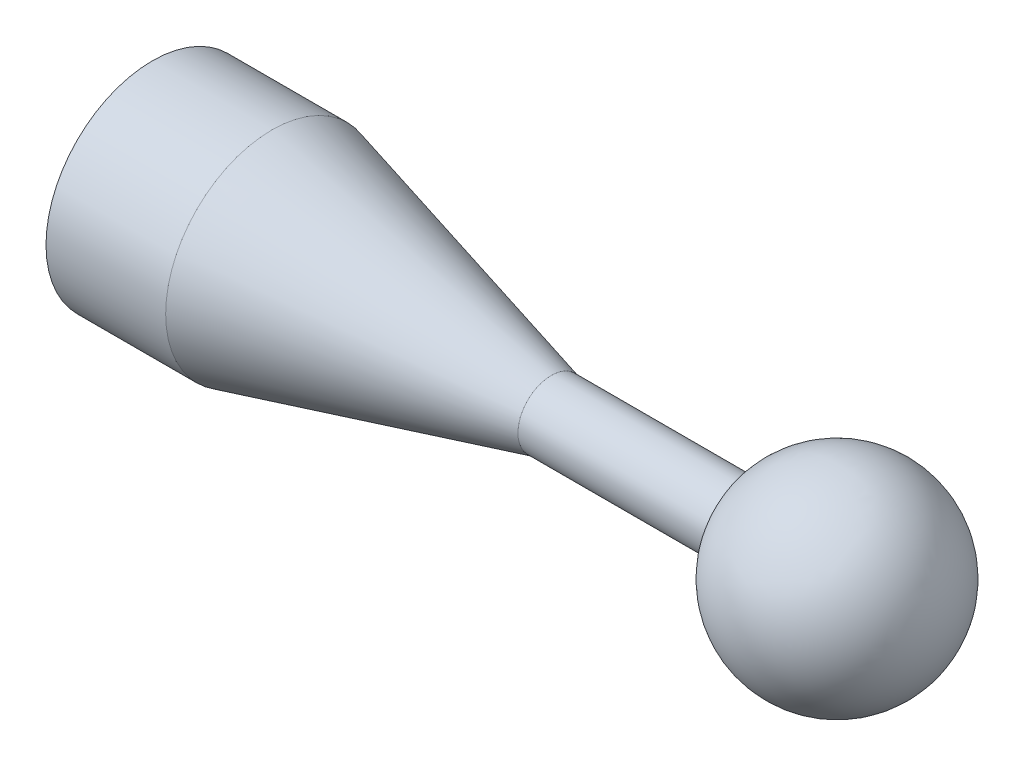
ISO-10303-21;
HEADER;
FILE_DESCRIPTION(('STEP AP214'),'2;1');
FILE_NAME('part.step','',(''),(''),'','','');
FILE_SCHEMA(('AUTOMOTIVE_DESIGN { 1 0 10303 214 1 1 1 1 }'));
ENDSEC;
DATA;
#1=APPLICATION_CONTEXT('core data for automotive mechanical design processes');
#2=APPLICATION_PROTOCOL_DEFINITION('international standard','automotive_design',2000,#1);
#3=PRODUCT_CONTEXT('',#1,'mechanical');
#4=PRODUCT('Part','Part','',(#3));
#5=PRODUCT_RELATED_PRODUCT_CATEGORY('part','',(#4));
#6=PRODUCT_DEFINITION_FORMATION('','',#4);
#7=PRODUCT_DEFINITION_CONTEXT('part definition',#1,'design');
#8=PRODUCT_DEFINITION('design','',#6,#7);
#9=PRODUCT_DEFINITION_SHAPE('','',#8);
#10=(LENGTH_UNIT() NAMED_UNIT(*) SI_UNIT(.MILLI.,.METRE.));
#11=(NAMED_UNIT(*) PLANE_ANGLE_UNIT() SI_UNIT($,.RADIAN.));
#12=(NAMED_UNIT(*) SI_UNIT($,.STERADIAN.) SOLID_ANGLE_UNIT());
#13=UNCERTAINTY_MEASURE_WITH_UNIT(LENGTH_MEASURE(1.E-05),#10,'distance_accuracy_value','');
#14=(GEOMETRIC_REPRESENTATION_CONTEXT(3) GLOBAL_UNCERTAINTY_ASSIGNED_CONTEXT((#13)) GLOBAL_UNIT_ASSIGNED_CONTEXT((#10,
#11,#12)) REPRESENTATION_CONTEXT('',''));
#15=CARTESIAN_POINT('',(0.,0.,0.));
#16=DIRECTION('',(0.,0.,1.));
#17=DIRECTION('',(1.,0.,0.));
#18=AXIS2_PLACEMENT_3D('',#15,#16,#17);
#19=CARTESIAN_POINT('',(103.,0.,0.));
#20=DIRECTION('',(-1.,0.,0.));
#21=DIRECTION('',(0.,1.,0.));
#22=AXIS2_PLACEMENT_3D('',#19,#20,#21);
#23=SPHERICAL_SURFACE('',#22,15.);
#24=CARTESIAN_POINT('',(88.857864376269,0.,0.));
#25=DIRECTION('',(-1.,0.,0.));
#26=DIRECTION('',(0.,0.,1.));
#27=AXIS2_PLACEMENT_3D('',#24,#25,#26);
#28=CIRCLE('',#27,5.);
#29=CARTESIAN_POINT('',(88.857864376269,0.,5.));
#30=VERTEX_POINT('',#29);
#31=EDGE_CURVE('E10',#30,#30,#28,.T.);
#32=ORIENTED_EDGE('',*,*,#31,.F.);
#33=EDGE_LOOP('',(#32));
#34=FACE_BOUND('',#33,.T.);
#35=ADVANCED_FACE('F37',(#34),#23,.T.);
#36=CARTESIAN_POINT('',(-11.8977150537634,0.,0.));
#37=DIRECTION('',(-1.,0.,0.));
#38=DIRECTION('',(0.,0.,1.));
#39=AXIS2_PLACEMENT_3D('',#36,#37,#38);
#40=CYLINDRICAL_SURFACE('',#39,5.);
#41=CARTESIAN_POINT('',(60.,0.,0.));
#42=DIRECTION('',(-1.,0.,0.));
#43=DIRECTION('',(0.,0.,1.));
#44=AXIS2_PLACEMENT_3D('',#41,#42,#43);
#45=CIRCLE('',#44,5.);
#46=CARTESIAN_POINT('',(60.,0.,5.));
#47=VERTEX_POINT('',#46);
#48=EDGE_CURVE('E43',#47,#47,#45,.T.);
#49=ORIENTED_EDGE('',*,*,#48,.F.);
#50=EDGE_LOOP('',(#49));
#51=FACE_BOUND('',#50,.T.);
#52=ORIENTED_EDGE('',*,*,#31,.T.);
#53=EDGE_LOOP('',(#52));
#54=FACE_BOUND('',#53,.T.);
#55=ADVANCED_FACE('F67',(#51,#54),#40,.T.);
#56=CARTESIAN_POINT('',(60.,0.,0.));
#57=DIRECTION('',(-1.,0.,0.));
#58=DIRECTION('',(0.,0.,1.));
#59=AXIS2_PLACEMENT_3D('',#56,#57,#58);
#60=CONICAL_SURFACE('',#59,5.,0.256151382565603);
#61=CARTESIAN_POINT('',(18.,0.,0.));
#62=DIRECTION('',(-1.,0.,0.));
#63=DIRECTION('',(0.,0.,1.));
#64=AXIS2_PLACEMENT_3D('',#61,#62,#63);
#65=CIRCLE('',#64,16.);
#66=CARTESIAN_POINT('',(18.,0.,16.));
#67=VERTEX_POINT('',#66);
#68=EDGE_CURVE('E47',#67,#67,#65,.T.);
#69=CARTESIAN_POINT('',(18.,0.,16.));
#70=CARTESIAN_POINT('',(18.4375,0.,15.8854166666667));
#71=CARTESIAN_POINT('',(18.875,0.,15.7708333333333));
#72=CARTESIAN_POINT('',(19.75,0.,15.5416666666667));
#73=CARTESIAN_POINT('',(20.1875,0.,15.4270833333333));
#74=CARTESIAN_POINT('',(21.0625,0.,15.1979166666667));
#75=CARTESIAN_POINT('',(21.5,0.,15.0833333333333));
#76=CARTESIAN_POINT('',(22.375,0.,14.8541666666667));
#77=CARTESIAN_POINT('',(22.8125,0.,14.7395833333333));
#78=CARTESIAN_POINT('',(23.6875,0.,14.5104166666667));
#79=CARTESIAN_POINT('',(24.125,0.,14.3958333333333));
#80=CARTESIAN_POINT('',(25.,0.,14.1666666666667));
#81=CARTESIAN_POINT('',(25.4375,0.,14.0520833333333));
#82=CARTESIAN_POINT('',(26.3125,0.,13.8229166666667));
#83=CARTESIAN_POINT('',(26.75,0.,13.7083333333333));
#84=CARTESIAN_POINT('',(27.625,0.,13.4791666666667));
#85=CARTESIAN_POINT('',(28.0625,0.,13.3645833333333));
#86=CARTESIAN_POINT('',(28.9375,0.,13.1354166666667));
#87=CARTESIAN_POINT('',(29.375,0.,13.0208333333333));
#88=CARTESIAN_POINT('',(30.25,0.,12.7916666666667));
#89=CARTESIAN_POINT('',(30.6875,0.,12.6770833333333));
#90=CARTESIAN_POINT('',(31.5625,0.,12.4479166666667));
#91=CARTESIAN_POINT('',(32.,0.,12.3333333333333));
#92=CARTESIAN_POINT('',(32.875,0.,12.1041666666667));
#93=CARTESIAN_POINT('',(33.3125,0.,11.9895833333333));
#94=CARTESIAN_POINT('',(34.1875,0.,11.7604166666667));
#95=CARTESIAN_POINT('',(34.625,0.,11.6458333333333));
#96=CARTESIAN_POINT('',(35.5,0.,11.4166666666667));
#97=CARTESIAN_POINT('',(35.9375,0.,11.3020833333333));
#98=CARTESIAN_POINT('',(36.8125,0.,11.0729166666667));
#99=CARTESIAN_POINT('',(37.25,0.,10.9583333333333));
#100=CARTESIAN_POINT('',(38.125,0.,10.7291666666667));
#101=CARTESIAN_POINT('',(38.5625,0.,10.6145833333333));
#102=CARTESIAN_POINT('',(39.4375,0.,10.3854166666667));
#103=CARTESIAN_POINT('',(39.875,0.,10.2708333333333));
#104=CARTESIAN_POINT('',(40.75,0.,10.0416666666667));
#105=CARTESIAN_POINT('',(41.1875,0.,9.92708333333333));
#106=CARTESIAN_POINT('',(42.0625,0.,9.69791666666667));
#107=CARTESIAN_POINT('',(42.5,0.,9.58333333333333));
#108=CARTESIAN_POINT('',(43.375,0.,9.35416666666666));
#109=CARTESIAN_POINT('',(43.8125,0.,9.23958333333333));
#110=CARTESIAN_POINT('',(44.6875,0.,9.01041666666666));
#111=CARTESIAN_POINT('',(45.125,0.,8.89583333333333));
#112=CARTESIAN_POINT('',(46.,0.,8.66666666666667));
#113=CARTESIAN_POINT('',(46.4375,0.,8.55208333333333));
#114=CARTESIAN_POINT('',(47.3125,0.,8.32291666666666));
#115=CARTESIAN_POINT('',(47.75,0.,8.20833333333333));
#116=CARTESIAN_POINT('',(48.625,0.,7.97916666666667));
#117=CARTESIAN_POINT('',(49.0625,0.,7.86458333333333));
#118=CARTESIAN_POINT('',(49.9375,0.,7.63541666666667));
#119=CARTESIAN_POINT('',(50.375,0.,7.52083333333333));
#120=CARTESIAN_POINT('',(51.25,0.,7.29166666666667));
#121=CARTESIAN_POINT('',(51.6875,0.,7.17708333333333));
#122=CARTESIAN_POINT('',(52.5625,0.,6.94791666666666));
#123=CARTESIAN_POINT('',(53.,0.,6.83333333333333));
#124=CARTESIAN_POINT('',(53.875,0.,6.60416666666666));
#125=CARTESIAN_POINT('',(54.3125,0.,6.48958333333333));
#126=CARTESIAN_POINT('',(55.1875,0.,6.26041666666667));
#127=CARTESIAN_POINT('',(55.625,0.,6.14583333333333));
#128=CARTESIAN_POINT('',(56.5,0.,5.91666666666667));
#129=CARTESIAN_POINT('',(56.9375,0.,5.80208333333333));
#130=CARTESIAN_POINT('',(57.8125,0.,5.57291666666667));
#131=CARTESIAN_POINT('',(58.25,0.,5.45833333333333));
#132=CARTESIAN_POINT('',(59.125,0.,5.22916666666667));
#133=CARTESIAN_POINT('',(59.5625,0.,5.11458333333333));
#134=CARTESIAN_POINT('',(60.,0.,5.));
#135=B_SPLINE_CURVE_WITH_KNOTS('',3,(#69,#70,#71,#72,#73,#74,#75,#76,#77,#78,#79,#80,#81,#82,
#83,#84,#85,#86,#87,#88,#89,#90,#91,#92,#93,#94,#95,#96,#97,#98,#99,#100,#101,#102,#103,#104,
#105,#106,#107,#108,#109,#110,#111,#112,#113,#114,#115,#116,#117,#118,#119,#120,#121,#122,#123,
#124,#125,#126,#127,#128,#129,#130,#131,#132,#133,#134),.UNSPECIFIED.,.F.,.F.,(4,2,2,2,2,2,2,2,
2,2,2,2,2,2,2,2,2,2,2,2,2,2,2,2,2,2,2,2,2,2,2,2,4),(0.,1.35676833413078,2.71353666826155,
4.07030500239232,5.4270733365231,6.78384167065388,8.14061000478465,9.49737833891543,
10.8541466730462,12.210915007177,13.5676833413078,14.9244516754385,16.2812200095693,
17.6379883437001,18.9947566778309,20.3515250119616,21.7082933460924,23.0650616802232,
24.421830014354,25.7785983484847,27.1353666826155,28.4921350167463,29.8489033508771,
31.2056716850078,32.5624400191386,33.9192083532694,35.2759766874002,36.632745021531,
37.9895133556617,39.3462816897925,40.7030500239233,42.0598183580541,43.4165866921848),.UNSPECIFIED.);
#136=EDGE_CURVE('BSEAM62',#67,#47,#135,.T.);
#137=ORIENTED_EDGE('',*,*,#68,.F.);
#138=ORIENTED_EDGE('',*,*,#48,.T.);
#139=ORIENTED_EDGE('',*,*,#136,.T.);
#140=ORIENTED_EDGE('',*,*,#136,.F.);
#141=EDGE_LOOP('',(#137,#139,#138,#140));
#142=FACE_BOUND('',#141,.T.);
#143=ADVANCED_FACE('F62',(#142),#60,.T.);
#144=CARTESIAN_POINT('',(-11.8977150537634,0.,0.));
#145=DIRECTION('',(-1.,0.,0.));
#146=DIRECTION('',(0.,0.,1.));
#147=AXIS2_PLACEMENT_3D('',#144,#145,#146);
#148=CYLINDRICAL_SURFACE('',#147,16.);
#149=CARTESIAN_POINT('',(0.,0.,0.));
#150=DIRECTION('',(-1.,0.,0.));
#151=DIRECTION('',(0.,0.,1.));
#152=AXIS2_PLACEMENT_3D('',#149,#150,#151);
#153=CIRCLE('',#152,16.);
#154=CARTESIAN_POINT('',(0.,0.,16.));
#155=VERTEX_POINT('',#154);
#156=EDGE_CURVE('E51',#155,#155,#153,.T.);
#157=ORIENTED_EDGE('',*,*,#156,.F.);
#158=EDGE_LOOP('',(#157));
#159=FACE_BOUND('',#158,.T.);
#160=ORIENTED_EDGE('',*,*,#68,.T.);
#161=EDGE_LOOP('',(#160));
#162=FACE_BOUND('',#161,.T.);
#163=ADVANCED_FACE('F59',(#159,#162),#148,.T.);
#164=CARTESIAN_POINT('',(0.,0.,0.));
#165=DIRECTION('',(1.,0.,0.));
#166=DIRECTION('',(0.,0.,-1.));
#167=AXIS2_PLACEMENT_3D('',#164,#165,#166);
#168=PLANE('',#167);
#169=ORIENTED_EDGE('',*,*,#156,.T.);
#170=EDGE_LOOP('',(#169));
#171=FACE_BOUND('',#170,.T.);
#172=ADVANCED_FACE('F57',(#171),#168,.F.);
#173=CLOSED_SHELL('',(#35,#55,#143,#163,#172));
#174=MANIFOLD_SOLID_BREP('B2',#173);
#175=ADVANCED_BREP_SHAPE_REPRESENTATION('',(#18,#174),#14);
#176=SHAPE_DEFINITION_REPRESENTATION(#9,#175);
ENDSEC;
END-ISO-10303-21;
